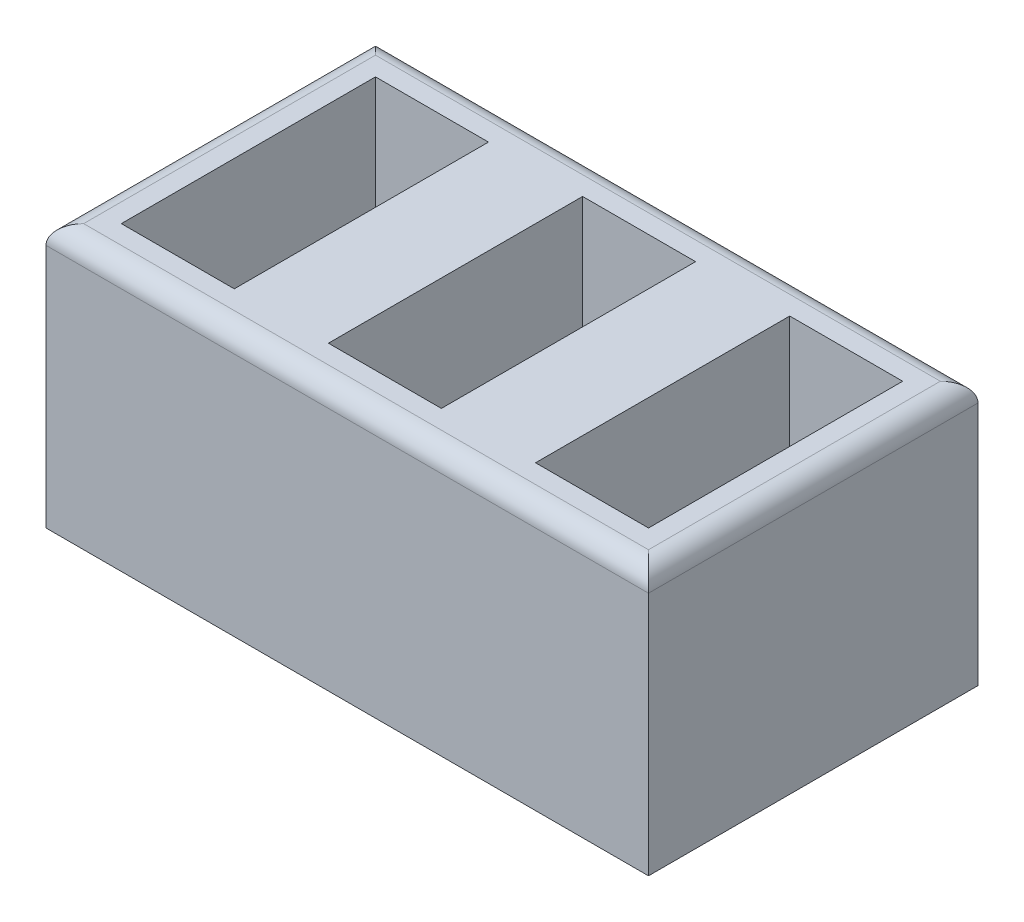
ISO-10303-21;
HEADER;
FILE_DESCRIPTION(('STEP AP214'),'2;1');
FILE_NAME('part.step','',(''),(''),'','','');
FILE_SCHEMA(('AUTOMOTIVE_DESIGN { 1 0 10303 214 1 1 1 1 }'));
ENDSEC;
DATA;
#1=APPLICATION_CONTEXT('core data for automotive mechanical design processes');
#2=APPLICATION_PROTOCOL_DEFINITION('international standard','automotive_design',2000,#1);
#3=PRODUCT_CONTEXT('',#1,'mechanical');
#4=PRODUCT('Part','Part','',(#3));
#5=PRODUCT_RELATED_PRODUCT_CATEGORY('part','',(#4));
#6=PRODUCT_DEFINITION_FORMATION('','',#4);
#7=PRODUCT_DEFINITION_CONTEXT('part definition',#1,'design');
#8=PRODUCT_DEFINITION('design','',#6,#7);
#9=PRODUCT_DEFINITION_SHAPE('','',#8);
#10=(LENGTH_UNIT() NAMED_UNIT(*) SI_UNIT(.MILLI.,.METRE.));
#11=(NAMED_UNIT(*) PLANE_ANGLE_UNIT() SI_UNIT($,.RADIAN.));
#12=(NAMED_UNIT(*) SI_UNIT($,.STERADIAN.) SOLID_ANGLE_UNIT());
#13=UNCERTAINTY_MEASURE_WITH_UNIT(LENGTH_MEASURE(1.E-05),#10,'distance_accuracy_value','');
#14=(GEOMETRIC_REPRESENTATION_CONTEXT(3) GLOBAL_UNCERTAINTY_ASSIGNED_CONTEXT((#13)) GLOBAL_UNIT_ASSIGNED_CONTEXT((#10,
#11,#12)) REPRESENTATION_CONTEXT('',''));
#15=CARTESIAN_POINT('',(0.,0.,0.));
#16=DIRECTION('',(0.,0.,1.));
#17=DIRECTION('',(1.,0.,0.));
#18=AXIS2_PLACEMENT_3D('',#15,#16,#17);
#19=CARTESIAN_POINT('',(22.,0.400000000000001,0.));
#20=DIRECTION('',(0.,1.,0.));
#21=DIRECTION('',(0.,0.,1.));
#22=AXIS2_PLACEMENT_3D('',#19,#20,#21);
#23=PLANE('',#22);
#24=DIRECTION('',(0.,0.,1.));
#25=VECTOR('',#24,1.);
#26=CARTESIAN_POINT('',(24.,0.400000000000001,-15.5));
#27=LINE('',#26,#25);
#28=CARTESIAN_POINT('',(24.,0.400000000000001,-15.5));
#29=VERTEX_POINT('',#28);
#30=CARTESIAN_POINT('',(24.,0.400000000000001,-2.));
#31=VERTEX_POINT('',#30);
#32=EDGE_CURVE('E267',#29,#31,#27,.T.);
#33=ORIENTED_EDGE('',*,*,#32,.T.);
#34=DIRECTION('',(1.,0.,0.));
#35=VECTOR('',#34,1.);
#36=CARTESIAN_POINT('',(24.,0.400000000000001,-2.));
#37=LINE('',#36,#35);
#38=CARTESIAN_POINT('',(30.,0.400000000000001,-2.));
#39=VERTEX_POINT('',#38);
#40=EDGE_CURVE('E285',#31,#39,#37,.T.);
#41=ORIENTED_EDGE('',*,*,#40,.T.);
#42=DIRECTION('',(0.,0.,-1.));
#43=VECTOR('',#42,1.);
#44=CARTESIAN_POINT('',(30.,0.400000000000001,-15.5));
#45=LINE('',#44,#43);
#46=CARTESIAN_POINT('',(30.,0.400000000000001,-15.5));
#47=VERTEX_POINT('',#46);
#48=EDGE_CURVE('E279',#39,#47,#45,.T.);
#49=ORIENTED_EDGE('',*,*,#48,.T.);
#50=DIRECTION('',(-1.,0.,0.));
#51=VECTOR('',#50,1.);
#52=CARTESIAN_POINT('',(24.,0.400000000000001,-15.5));
#53=LINE('',#52,#51);
#54=EDGE_CURVE('E273',#47,#29,#53,.T.);
#55=ORIENTED_EDGE('',*,*,#54,.T.);
#56=EDGE_LOOP('',(#33,#41,#49,#55));
#57=FACE_BOUND('',#56,.T.);
#58=ADVANCED_FACE('F36',(#57),#23,.T.);
#59=CARTESIAN_POINT('',(24.,0.400000000000001,-2.));
#60=DIRECTION('',(0.,0.,1.));
#61=DIRECTION('',(1.,0.,0.));
#62=AXIS2_PLACEMENT_3D('',#59,#60,#61);
#63=PLANE('',#62);
#64=DIRECTION('',(1.,0.,0.));
#65=VECTOR('',#64,1.);
#66=CARTESIAN_POINT('',(24.,14.,-2.));
#67=LINE('',#66,#65);
#68=CARTESIAN_POINT('',(24.,14.,-2.));
#69=VERTEX_POINT('',#68);
#70=CARTESIAN_POINT('',(30.,14.,-2.));
#71=VERTEX_POINT('',#70);
#72=EDGE_CURVE('E261',#69,#71,#67,.T.);
#73=ORIENTED_EDGE('',*,*,#72,.T.);
#74=DIRECTION('',(0.,1.,0.));
#75=VECTOR('',#74,1.);
#76=CARTESIAN_POINT('',(30.,0.400000000000001,-2.));
#77=LINE('',#76,#75);
#78=EDGE_CURVE('E282',#39,#71,#77,.T.);
#79=ORIENTED_EDGE('',*,*,#78,.F.);
#80=ORIENTED_EDGE('',*,*,#40,.F.);
#81=DIRECTION('',(0.,1.,0.));
#82=VECTOR('',#81,1.);
#83=CARTESIAN_POINT('',(24.,0.400000000000001,-2.));
#84=LINE('',#83,#82);
#85=EDGE_CURVE('E264',#31,#69,#84,.T.);
#86=ORIENTED_EDGE('',*,*,#85,.T.);
#87=EDGE_LOOP('',(#73,#79,#80,#86));
#88=FACE_BOUND('',#87,.T.);
#89=ADVANCED_FACE('F347',(#88),#63,.F.);
#90=CARTESIAN_POINT('',(30.,0.400000000000001,-15.5));
#91=DIRECTION('',(1.,0.,0.));
#92=DIRECTION('',(0.,0.,-1.));
#93=AXIS2_PLACEMENT_3D('',#90,#91,#92);
#94=PLANE('',#93);
#95=DIRECTION('',(0.,0.,-1.));
#96=VECTOR('',#95,1.);
#97=CARTESIAN_POINT('',(30.,14.,-15.5));
#98=LINE('',#97,#96);
#99=CARTESIAN_POINT('',(30.,14.,-15.5));
#100=VERTEX_POINT('',#99);
#101=EDGE_CURVE('E258',#71,#100,#98,.T.);
#102=ORIENTED_EDGE('',*,*,#101,.T.);
#103=DIRECTION('',(0.,1.,0.));
#104=VECTOR('',#103,1.);
#105=CARTESIAN_POINT('',(30.,0.400000000000001,-15.5));
#106=LINE('',#105,#104);
#107=EDGE_CURVE('E276',#47,#100,#106,.T.);
#108=ORIENTED_EDGE('',*,*,#107,.F.);
#109=ORIENTED_EDGE('',*,*,#48,.F.);
#110=ORIENTED_EDGE('',*,*,#78,.T.);
#111=EDGE_LOOP('',(#102,#108,#109,#110));
#112=FACE_BOUND('',#111,.T.);
#113=ADVANCED_FACE('F349',(#112),#94,.F.);
#114=CARTESIAN_POINT('',(24.,0.400000000000001,-15.5));
#115=DIRECTION('',(0.,0.,-1.));
#116=DIRECTION('',(-1.,0.,0.));
#117=AXIS2_PLACEMENT_3D('',#114,#115,#116);
#118=PLANE('',#117);
#119=DIRECTION('',(-1.,0.,0.));
#120=VECTOR('',#119,1.);
#121=CARTESIAN_POINT('',(24.,14.,-15.5));
#122=LINE('',#121,#120);
#123=CARTESIAN_POINT('',(24.,14.,-15.5));
#124=VERTEX_POINT('',#123);
#125=EDGE_CURVE('E255',#100,#124,#122,.T.);
#126=ORIENTED_EDGE('',*,*,#125,.T.);
#127=DIRECTION('',(0.,1.,0.));
#128=VECTOR('',#127,1.);
#129=CARTESIAN_POINT('',(24.,0.400000000000001,-15.5));
#130=LINE('',#129,#128);
#131=EDGE_CURVE('E270',#29,#124,#130,.T.);
#132=ORIENTED_EDGE('',*,*,#131,.F.);
#133=ORIENTED_EDGE('',*,*,#54,.F.);
#134=ORIENTED_EDGE('',*,*,#107,.T.);
#135=EDGE_LOOP('',(#126,#132,#133,#134));
#136=FACE_BOUND('',#135,.T.);
#137=ADVANCED_FACE('F340',(#136),#118,.F.);
#138=CARTESIAN_POINT('',(24.,0.400000000000001,-15.5));
#139=DIRECTION('',(-1.,0.,0.));
#140=DIRECTION('',(0.,0.,1.));
#141=AXIS2_PLACEMENT_3D('',#138,#139,#140);
#142=PLANE('',#141);
#143=DIRECTION('',(0.,0.,1.));
#144=VECTOR('',#143,1.);
#145=CARTESIAN_POINT('',(24.,14.,-15.5));
#146=LINE('',#145,#144);
#147=EDGE_CURVE('E253',#124,#69,#146,.T.);
#148=ORIENTED_EDGE('',*,*,#147,.T.);
#149=ORIENTED_EDGE('',*,*,#85,.F.);
#150=ORIENTED_EDGE('',*,*,#32,.F.);
#151=ORIENTED_EDGE('',*,*,#131,.T.);
#152=EDGE_LOOP('',(#148,#149,#150,#151));
#153=FACE_BOUND('',#152,.T.);
#154=ADVANCED_FACE('F342',(#153),#142,.F.);
#155=CARTESIAN_POINT('',(0.,14.,0.));
#156=DIRECTION('',(1.,0.,0.));
#157=DIRECTION('',(0.,0.,-1.));
#158=AXIS2_PLACEMENT_3D('',#155,#156,#157);
#159=PLANE('',#158);
#160=DIRECTION('',(0.,-1.,0.));
#161=VECTOR('',#160,1.);
#162=CARTESIAN_POINT('',(0.,14.,0.));
#163=LINE('',#162,#161);
#164=CARTESIAN_POINT('',(0.,13.,0.));
#165=VERTEX_POINT('',#164);
#166=CARTESIAN_POINT('',(0.,0.,0.));
#167=VERTEX_POINT('',#166);
#168=EDGE_CURVE('E251',#165,#167,#163,.T.);
#169=ORIENTED_EDGE('',*,*,#168,.F.);
#170=DIRECTION('',(0.,0.,1.));
#171=VECTOR('',#170,1.);
#172=CARTESIAN_POINT('',(0.,13.,0.));
#173=LINE('',#172,#171);
#174=CARTESIAN_POINT('',(0.,13.,-17.5));
#175=VERTEX_POINT('',#174);
#176=EDGE_CURVE('E297',#165,#175,#173,.F.);
#177=ORIENTED_EDGE('',*,*,#176,.T.);
#178=DIRECTION('',(0.,-1.,0.));
#179=VECTOR('',#178,1.);
#180=CARTESIAN_POINT('',(0.,14.,-17.5));
#181=LINE('',#180,#179);
#182=CARTESIAN_POINT('',(0.,0.,-17.5));
#183=VERTEX_POINT('',#182);
#184=EDGE_CURVE('E245',#175,#183,#181,.T.);
#185=ORIENTED_EDGE('',*,*,#184,.T.);
#186=DIRECTION('',(0.,0.,1.));
#187=VECTOR('',#186,1.);
#188=CARTESIAN_POINT('',(0.,0.,0.));
#189=LINE('',#188,#187);
#190=EDGE_CURVE('E227',#183,#167,#189,.T.);
#191=ORIENTED_EDGE('',*,*,#190,.T.);
#192=EDGE_LOOP('',(#169,#177,#185,#191));
#193=FACE_BOUND('',#192,.T.);
#194=ADVANCED_FACE('F387',(#193),#159,.F.);
#195=CARTESIAN_POINT('',(0.,14.,0.));
#196=DIRECTION('',(0.,0.,-1.));
#197=DIRECTION('',(-1.,0.,0.));
#198=AXIS2_PLACEMENT_3D('',#195,#196,#197);
#199=PLANE('',#198);
#200=DIRECTION('',(0.,-1.,0.));
#201=VECTOR('',#200,1.);
#202=CARTESIAN_POINT('',(32.,14.,0.));
#203=LINE('',#202,#201);
#204=CARTESIAN_POINT('',(32.,13.,0.));
#205=VERTEX_POINT('',#204);
#206=CARTESIAN_POINT('',(32.,0.,0.));
#207=VERTEX_POINT('',#206);
#208=EDGE_CURVE('E249',#205,#207,#203,.T.);
#209=ORIENTED_EDGE('',*,*,#208,.F.);
#210=DIRECTION('',(1.,0.,0.));
#211=VECTOR('',#210,1.);
#212=CARTESIAN_POINT('',(0.,13.,0.));
#213=LINE('',#212,#211);
#214=EDGE_CURVE('E45',#205,#165,#213,.F.);
#215=ORIENTED_EDGE('',*,*,#214,.T.);
#216=ORIENTED_EDGE('',*,*,#168,.T.);
#217=DIRECTION('',(1.,0.,0.));
#218=VECTOR('',#217,1.);
#219=CARTESIAN_POINT('',(0.,0.,0.));
#220=LINE('',#219,#218);
#221=EDGE_CURVE('E236',#167,#207,#220,.T.);
#222=ORIENTED_EDGE('',*,*,#221,.T.);
#223=EDGE_LOOP('',(#209,#215,#216,#222));
#224=FACE_BOUND('',#223,.T.);
#225=ADVANCED_FACE('F383',(#224),#199,.F.);
#226=CARTESIAN_POINT('',(32.,14.,0.));
#227=DIRECTION('',(-1.,0.,0.));
#228=DIRECTION('',(0.,0.,1.));
#229=AXIS2_PLACEMENT_3D('',#226,#227,#228);
#230=PLANE('',#229);
#231=DIRECTION('',(0.,-1.,0.));
#232=VECTOR('',#231,1.);
#233=CARTESIAN_POINT('',(32.,14.,-17.5));
#234=LINE('',#233,#232);
#235=CARTESIAN_POINT('',(32.,13.,-17.5));
#236=VERTEX_POINT('',#235);
#237=CARTESIAN_POINT('',(32.,0.,-17.5));
#238=VERTEX_POINT('',#237);
#239=EDGE_CURVE('E247',#236,#238,#234,.T.);
#240=ORIENTED_EDGE('',*,*,#239,.F.);
#241=DIRECTION('',(0.,0.,-1.));
#242=VECTOR('',#241,1.);
#243=CARTESIAN_POINT('',(32.,13.,0.));
#244=LINE('',#243,#242);
#245=EDGE_CURVE('E11',#236,#205,#244,.F.);
#246=ORIENTED_EDGE('',*,*,#245,.T.);
#247=ORIENTED_EDGE('',*,*,#208,.T.);
#248=DIRECTION('',(0.,0.,-1.));
#249=VECTOR('',#248,1.);
#250=CARTESIAN_POINT('',(32.,0.,0.));
#251=LINE('',#250,#249);
#252=EDGE_CURVE('E239',#207,#238,#251,.T.);
#253=ORIENTED_EDGE('',*,*,#252,.T.);
#254=EDGE_LOOP('',(#240,#246,#247,#253));
#255=FACE_BOUND('',#254,.T.);
#256=ADVANCED_FACE('F394',(#255),#230,.F.);
#257=CARTESIAN_POINT('',(0.,14.,-17.5));
#258=DIRECTION('',(0.,0.,1.));
#259=DIRECTION('',(1.,0.,0.));
#260=AXIS2_PLACEMENT_3D('',#257,#258,#259);
#261=PLANE('',#260);
#262=ORIENTED_EDGE('',*,*,#184,.F.);
#263=DIRECTION('',(-1.,0.,0.));
#264=VECTOR('',#263,1.);
#265=CARTESIAN_POINT('',(0.,13.,-17.5));
#266=LINE('',#265,#264);
#267=EDGE_CURVE('E59',#175,#236,#266,.F.);
#268=ORIENTED_EDGE('',*,*,#267,.T.);
#269=ORIENTED_EDGE('',*,*,#239,.T.);
#270=DIRECTION('',(-1.,0.,0.));
#271=VECTOR('',#270,1.);
#272=CARTESIAN_POINT('',(0.,0.,-17.5));
#273=LINE('',#272,#271);
#274=EDGE_CURVE('E242',#238,#183,#273,.T.);
#275=ORIENTED_EDGE('',*,*,#274,.T.);
#276=EDGE_LOOP('',(#262,#268,#269,#275));
#277=FACE_BOUND('',#276,.T.);
#278=ADVANCED_FACE('F329',(#277),#261,.F.);
#279=CARTESIAN_POINT('',(0.,14.,0.));
#280=DIRECTION('',(0.,-1.,0.));
#281=DIRECTION('',(0.,0.,-1.));
#282=AXIS2_PLACEMENT_3D('',#279,#280,#281);
#283=PLANE('',#282);
#284=DIRECTION('',(-1.,0.,0.));
#285=VECTOR('',#284,1.);
#286=CARTESIAN_POINT('',(0.,14.,-16.5));
#287=LINE('',#286,#285);
#288=CARTESIAN_POINT('',(31.,14.,-16.5));
#289=VERTEX_POINT('',#288);
#290=CARTESIAN_POINT('',(1.,14.,-16.5));
#291=VERTEX_POINT('',#290);
#292=EDGE_CURVE('E292',#289,#291,#287,.T.);
#293=ORIENTED_EDGE('',*,*,#292,.T.);
#294=DIRECTION('',(0.,0.,1.));
#295=VECTOR('',#294,1.);
#296=CARTESIAN_POINT('',(1.,14.,0.));
#297=LINE('',#296,#295);
#298=CARTESIAN_POINT('',(1.,14.,-1.));
#299=VERTEX_POINT('',#298);
#300=EDGE_CURVE('E294',#291,#299,#297,.T.);
#301=ORIENTED_EDGE('',*,*,#300,.T.);
#302=DIRECTION('',(1.,0.,0.));
#303=VECTOR('',#302,1.);
#304=CARTESIAN_POINT('',(0.,14.,-1.));
#305=LINE('',#304,#303);
#306=CARTESIAN_POINT('',(31.,14.,-1.));
#307=VERTEX_POINT('',#306);
#308=EDGE_CURVE('E290',#299,#307,#305,.T.);
#309=ORIENTED_EDGE('',*,*,#308,.T.);
#310=DIRECTION('',(0.,0.,-1.));
#311=VECTOR('',#310,1.);
#312=CARTESIAN_POINT('',(31.,14.,0.));
#313=LINE('',#312,#311);
#314=EDGE_CURVE('E288',#307,#289,#313,.T.);
#315=ORIENTED_EDGE('',*,*,#314,.T.);
#316=EDGE_LOOP('',(#293,#301,#309,#315));
#317=FACE_BOUND('',#316,.T.);
#318=DIRECTION('',(1.,0.,0.));
#319=VECTOR('',#318,1.);
#320=CARTESIAN_POINT('',(13.,14.,-2.));
#321=LINE('',#320,#319);
#322=CARTESIAN_POINT('',(13.,14.,-2.));
#323=VERTEX_POINT('',#322);
#324=CARTESIAN_POINT('',(19.,14.,-2.));
#325=VERTEX_POINT('',#324);
#326=EDGE_CURVE('E172',#323,#325,#321,.T.);
#327=ORIENTED_EDGE('',*,*,#326,.F.);
#328=DIRECTION('',(0.,0.,1.));
#329=VECTOR('',#328,1.);
#330=CARTESIAN_POINT('',(13.,14.,-15.5));
#331=LINE('',#330,#329);
#332=CARTESIAN_POINT('',(13.,14.,-15.5));
#333=VERTEX_POINT('',#332);
#334=EDGE_CURVE('E186',#333,#323,#331,.T.);
#335=ORIENTED_EDGE('',*,*,#334,.F.);
#336=DIRECTION('',(-1.,0.,0.));
#337=VECTOR('',#336,1.);
#338=CARTESIAN_POINT('',(13.,14.,-15.5));
#339=LINE('',#338,#337);
#340=CARTESIAN_POINT('',(19.,14.,-15.5));
#341=VERTEX_POINT('',#340);
#342=EDGE_CURVE('E196',#341,#333,#339,.T.);
#343=ORIENTED_EDGE('',*,*,#342,.F.);
#344=DIRECTION('',(0.,0.,-1.));
#345=VECTOR('',#344,1.);
#346=CARTESIAN_POINT('',(19.,14.,-15.5));
#347=LINE('',#346,#345);
#348=EDGE_CURVE('E187',#325,#341,#347,.T.);
#349=ORIENTED_EDGE('',*,*,#348,.F.);
#350=EDGE_LOOP('',(#327,#335,#343,#349));
#351=FACE_BOUND('',#350,.T.);
#352=DIRECTION('',(1.,0.,0.));
#353=VECTOR('',#352,1.);
#354=CARTESIAN_POINT('',(2.,14.,-2.));
#355=LINE('',#354,#353);
#356=CARTESIAN_POINT('',(2.,14.,-2.));
#357=VERTEX_POINT('',#356);
#358=CARTESIAN_POINT('',(8.,14.,-2.));
#359=VERTEX_POINT('',#358);
#360=EDGE_CURVE('E217',#357,#359,#355,.T.);
#361=ORIENTED_EDGE('',*,*,#360,.F.);
#362=DIRECTION('',(0.,0.,1.));
#363=VECTOR('',#362,1.);
#364=CARTESIAN_POINT('',(2.,14.,-15.5));
#365=LINE('',#364,#363);
#366=CARTESIAN_POINT('',(2.,14.,-15.5));
#367=VERTEX_POINT('',#366);
#368=EDGE_CURVE('E201',#367,#357,#365,.T.);
#369=ORIENTED_EDGE('',*,*,#368,.F.);
#370=DIRECTION('',(-1.,0.,0.));
#371=VECTOR('',#370,1.);
#372=CARTESIAN_POINT('',(2.,14.,-15.5));
#373=LINE('',#372,#371);
#374=CARTESIAN_POINT('',(8.,14.,-15.5));
#375=VERTEX_POINT('',#374);
#376=EDGE_CURVE('E206',#375,#367,#373,.T.);
#377=ORIENTED_EDGE('',*,*,#376,.F.);
#378=DIRECTION('',(0.,0.,-1.));
#379=VECTOR('',#378,1.);
#380=CARTESIAN_POINT('',(8.,14.,-15.5));
#381=LINE('',#380,#379);
#382=EDGE_CURVE('E220',#359,#375,#381,.T.);
#383=ORIENTED_EDGE('',*,*,#382,.F.);
#384=EDGE_LOOP('',(#361,#369,#377,#383));
#385=FACE_BOUND('',#384,.T.);
#386=ORIENTED_EDGE('',*,*,#147,.F.);
#387=ORIENTED_EDGE('',*,*,#125,.F.);
#388=ORIENTED_EDGE('',*,*,#101,.F.);
#389=ORIENTED_EDGE('',*,*,#72,.F.);
#390=EDGE_LOOP('',(#386,#387,#388,#389));
#391=FACE_BOUND('',#390,.T.);
#392=ADVANCED_FACE('F325',(#317,#351,#385,#391),#283,.F.);
#393=CARTESIAN_POINT('',(0.,0.,0.));
#394=DIRECTION('',(0.,-1.,0.));
#395=DIRECTION('',(0.,0.,-1.));
#396=AXIS2_PLACEMENT_3D('',#393,#394,#395);
#397=PLANE('',#396);
#398=ORIENTED_EDGE('',*,*,#190,.F.);
#399=ORIENTED_EDGE('',*,*,#274,.F.);
#400=ORIENTED_EDGE('',*,*,#252,.F.);
#401=ORIENTED_EDGE('',*,*,#221,.F.);
#402=EDGE_LOOP('',(#398,#399,#400,#401));
#403=FACE_BOUND('',#402,.T.);
#404=ADVANCED_FACE('F328',(#403),#397,.T.);
#405=CARTESIAN_POINT('',(2.,0.400000000000001,-15.5));
#406=DIRECTION('',(-1.,0.,0.));
#407=DIRECTION('',(0.,0.,1.));
#408=AXIS2_PLACEMENT_3D('',#405,#406,#407);
#409=PLANE('',#408);
#410=ORIENTED_EDGE('',*,*,#368,.T.);
#411=DIRECTION('',(0.,1.,0.));
#412=VECTOR('',#411,1.);
#413=CARTESIAN_POINT('',(2.,0.400000000000001,-2.));
#414=LINE('',#413,#412);
#415=CARTESIAN_POINT('',(2.,0.400000000000001,-2.));
#416=VERTEX_POINT('',#415);
#417=EDGE_CURVE('E215',#416,#357,#414,.T.);
#418=ORIENTED_EDGE('',*,*,#417,.F.);
#419=DIRECTION('',(0.,0.,1.));
#420=VECTOR('',#419,1.);
#421=CARTESIAN_POINT('',(2.,0.400000000000001,-15.5));
#422=LINE('',#421,#420);
#423=CARTESIAN_POINT('',(2.,0.400000000000001,-15.5));
#424=VERTEX_POINT('',#423);
#425=EDGE_CURVE('E202',#424,#416,#422,.T.);
#426=ORIENTED_EDGE('',*,*,#425,.F.);
#427=DIRECTION('',(0.,1.,0.));
#428=VECTOR('',#427,1.);
#429=CARTESIAN_POINT('',(2.,0.400000000000001,-15.5));
#430=LINE('',#429,#428);
#431=EDGE_CURVE('E225',#424,#367,#430,.T.);
#432=ORIENTED_EDGE('',*,*,#431,.T.);
#433=EDGE_LOOP('',(#410,#418,#426,#432));
#434=FACE_BOUND('',#433,.T.);
#435=ADVANCED_FACE('F546',(#434),#409,.F.);
#436=CARTESIAN_POINT('',(2.,0.400000000000001,-15.5));
#437=DIRECTION('',(0.,0.,-1.));
#438=DIRECTION('',(-1.,0.,0.));
#439=AXIS2_PLACEMENT_3D('',#436,#437,#438);
#440=PLANE('',#439);
#441=ORIENTED_EDGE('',*,*,#376,.T.);
#442=ORIENTED_EDGE('',*,*,#431,.F.);
#443=DIRECTION('',(-1.,0.,0.));
#444=VECTOR('',#443,1.);
#445=CARTESIAN_POINT('',(2.,0.400000000000001,-15.5));
#446=LINE('',#445,#444);
#447=CARTESIAN_POINT('',(8.,0.400000000000001,-15.5));
#448=VERTEX_POINT('',#447);
#449=EDGE_CURVE('E212',#448,#424,#446,.T.);
#450=ORIENTED_EDGE('',*,*,#449,.F.);
#451=DIRECTION('',(0.,1.,0.));
#452=VECTOR('',#451,1.);
#453=CARTESIAN_POINT('',(8.,0.400000000000001,-15.5));
#454=LINE('',#453,#452);
#455=EDGE_CURVE('E228',#448,#375,#454,.T.);
#456=ORIENTED_EDGE('',*,*,#455,.T.);
#457=EDGE_LOOP('',(#441,#442,#450,#456));
#458=FACE_BOUND('',#457,.T.);
#459=ADVANCED_FACE('F537',(#458),#440,.F.);
#460=CARTESIAN_POINT('',(8.,0.400000000000001,-15.5));
#461=DIRECTION('',(1.,0.,0.));
#462=DIRECTION('',(0.,0.,-1.));
#463=AXIS2_PLACEMENT_3D('',#460,#461,#462);
#464=PLANE('',#463);
#465=ORIENTED_EDGE('',*,*,#382,.T.);
#466=ORIENTED_EDGE('',*,*,#455,.F.);
#467=DIRECTION('',(0.,0.,-1.));
#468=VECTOR('',#467,1.);
#469=CARTESIAN_POINT('',(8.,0.400000000000001,-15.5));
#470=LINE('',#469,#468);
#471=CARTESIAN_POINT('',(8.,0.400000000000001,-2.));
#472=VERTEX_POINT('',#471);
#473=EDGE_CURVE('E209',#472,#448,#470,.T.);
#474=ORIENTED_EDGE('',*,*,#473,.F.);
#475=DIRECTION('',(0.,1.,0.));
#476=VECTOR('',#475,1.);
#477=CARTESIAN_POINT('',(8.,0.400000000000001,-2.));
#478=LINE('',#477,#476);
#479=EDGE_CURVE('E230',#472,#359,#478,.T.);
#480=ORIENTED_EDGE('',*,*,#479,.T.);
#481=EDGE_LOOP('',(#465,#466,#474,#480));
#482=FACE_BOUND('',#481,.T.);
#483=ADVANCED_FACE('F528',(#482),#464,.F.);
#484=CARTESIAN_POINT('',(2.,0.400000000000001,-2.));
#485=DIRECTION('',(0.,0.,1.));
#486=DIRECTION('',(1.,0.,0.));
#487=AXIS2_PLACEMENT_3D('',#484,#485,#486);
#488=PLANE('',#487);
#489=ORIENTED_EDGE('',*,*,#360,.T.);
#490=ORIENTED_EDGE('',*,*,#479,.F.);
#491=DIRECTION('',(1.,0.,0.));
#492=VECTOR('',#491,1.);
#493=CARTESIAN_POINT('',(2.,0.400000000000001,-2.));
#494=LINE('',#493,#492);
#495=EDGE_CURVE('E205',#416,#472,#494,.T.);
#496=ORIENTED_EDGE('',*,*,#495,.F.);
#497=ORIENTED_EDGE('',*,*,#417,.T.);
#498=EDGE_LOOP('',(#489,#490,#496,#497));
#499=FACE_BOUND('',#498,.T.);
#500=ADVANCED_FACE('F519',(#499),#488,.F.);
#501=CARTESIAN_POINT('',(0.,0.400000000000001,0.));
#502=DIRECTION('',(0.,1.,0.));
#503=DIRECTION('',(0.,0.,1.));
#504=AXIS2_PLACEMENT_3D('',#501,#502,#503);
#505=PLANE('',#504);
#506=ORIENTED_EDGE('',*,*,#425,.T.);
#507=ORIENTED_EDGE('',*,*,#495,.T.);
#508=ORIENTED_EDGE('',*,*,#473,.T.);
#509=ORIENTED_EDGE('',*,*,#449,.T.);
#510=EDGE_LOOP('',(#506,#507,#508,#509));
#511=FACE_BOUND('',#510,.T.);
#512=ADVANCED_FACE('F491',(#511),#505,.T.);
#513=CARTESIAN_POINT('',(13.,0.400000000000001,-15.5));
#514=DIRECTION('',(-1.,0.,0.));
#515=DIRECTION('',(0.,0.,1.));
#516=AXIS2_PLACEMENT_3D('',#513,#514,#515);
#517=PLANE('',#516);
#518=ORIENTED_EDGE('',*,*,#334,.T.);
#519=DIRECTION('',(0.,1.,0.));
#520=VECTOR('',#519,1.);
#521=CARTESIAN_POINT('',(13.,0.400000000000001,-2.));
#522=LINE('',#521,#520);
#523=CARTESIAN_POINT('',(13.,0.400000000000001,-2.));
#524=VERTEX_POINT('',#523);
#525=EDGE_CURVE('E178',#524,#323,#522,.T.);
#526=ORIENTED_EDGE('',*,*,#525,.F.);
#527=DIRECTION('',(0.,0.,1.));
#528=VECTOR('',#527,1.);
#529=CARTESIAN_POINT('',(13.,0.400000000000001,-15.5));
#530=LINE('',#529,#528);
#531=CARTESIAN_POINT('',(13.,0.400000000000001,-15.5));
#532=VERTEX_POINT('',#531);
#533=EDGE_CURVE('E161',#532,#524,#530,.T.);
#534=ORIENTED_EDGE('',*,*,#533,.F.);
#535=DIRECTION('',(0.,1.,0.));
#536=VECTOR('',#535,1.);
#537=CARTESIAN_POINT('',(13.,0.400000000000001,-15.5));
#538=LINE('',#537,#536);
#539=EDGE_CURVE('E198',#532,#333,#538,.T.);
#540=ORIENTED_EDGE('',*,*,#539,.T.);
#541=EDGE_LOOP('',(#518,#526,#534,#540));
#542=FACE_BOUND('',#541,.T.);
#543=ADVANCED_FACE('F184',(#542),#517,.F.);
#544=CARTESIAN_POINT('',(13.,0.400000000000001,-15.5));
#545=DIRECTION('',(0.,0.,-1.));
#546=DIRECTION('',(-1.,0.,0.));
#547=AXIS2_PLACEMENT_3D('',#544,#545,#546);
#548=PLANE('',#547);
#549=ORIENTED_EDGE('',*,*,#342,.T.);
#550=ORIENTED_EDGE('',*,*,#539,.F.);
#551=DIRECTION('',(-1.,0.,0.));
#552=VECTOR('',#551,1.);
#553=CARTESIAN_POINT('',(13.,0.400000000000001,-15.5));
#554=LINE('',#553,#552);
#555=CARTESIAN_POINT('',(19.,0.400000000000001,-15.5));
#556=VERTEX_POINT('',#555);
#557=EDGE_CURVE('E167',#556,#532,#554,.T.);
#558=ORIENTED_EDGE('',*,*,#557,.F.);
#559=DIRECTION('',(0.,1.,0.));
#560=VECTOR('',#559,1.);
#561=CARTESIAN_POINT('',(19.,0.400000000000001,-15.5));
#562=LINE('',#561,#560);
#563=EDGE_CURVE('E189',#556,#341,#562,.T.);
#564=ORIENTED_EDGE('',*,*,#563,.T.);
#565=EDGE_LOOP('',(#549,#550,#558,#564));
#566=FACE_BOUND('',#565,.T.);
#567=ADVANCED_FACE('F320',(#566),#548,.F.);
#568=CARTESIAN_POINT('',(19.,0.400000000000001,-15.5));
#569=DIRECTION('',(1.,0.,0.));
#570=DIRECTION('',(0.,0.,-1.));
#571=AXIS2_PLACEMENT_3D('',#568,#569,#570);
#572=PLANE('',#571);
#573=ORIENTED_EDGE('',*,*,#348,.T.);
#574=ORIENTED_EDGE('',*,*,#563,.F.);
#575=DIRECTION('',(0.,0.,-1.));
#576=VECTOR('',#575,1.);
#577=CARTESIAN_POINT('',(19.,0.400000000000001,-15.5));
#578=LINE('',#577,#576);
#579=CARTESIAN_POINT('',(19.,0.400000000000001,-2.));
#580=VERTEX_POINT('',#579);
#581=EDGE_CURVE('E182',#580,#556,#578,.T.);
#582=ORIENTED_EDGE('',*,*,#581,.F.);
#583=DIRECTION('',(0.,1.,0.));
#584=VECTOR('',#583,1.);
#585=CARTESIAN_POINT('',(19.,0.400000000000001,-2.));
#586=LINE('',#585,#584);
#587=EDGE_CURVE('E181',#580,#325,#586,.T.);
#588=ORIENTED_EDGE('',*,*,#587,.T.);
#589=EDGE_LOOP('',(#573,#574,#582,#588));
#590=FACE_BOUND('',#589,.T.);
#591=ADVANCED_FACE('F322',(#590),#572,.F.);
#592=CARTESIAN_POINT('',(13.,0.400000000000001,-2.));
#593=DIRECTION('',(0.,0.,1.));
#594=DIRECTION('',(1.,0.,0.));
#595=AXIS2_PLACEMENT_3D('',#592,#593,#594);
#596=PLANE('',#595);
#597=ORIENTED_EDGE('',*,*,#326,.T.);
#598=ORIENTED_EDGE('',*,*,#587,.F.);
#599=DIRECTION('',(1.,0.,0.));
#600=VECTOR('',#599,1.);
#601=CARTESIAN_POINT('',(13.,0.400000000000001,-2.));
#602=LINE('',#601,#600);
#603=EDGE_CURVE('E164',#524,#580,#602,.T.);
#604=ORIENTED_EDGE('',*,*,#603,.F.);
#605=ORIENTED_EDGE('',*,*,#525,.T.);
#606=EDGE_LOOP('',(#597,#598,#604,#605));
#607=FACE_BOUND('',#606,.T.);
#608=ADVANCED_FACE('F177',(#607),#596,.F.);
#609=CARTESIAN_POINT('',(11.,0.400000000000001,0.));
#610=DIRECTION('',(0.,1.,0.));
#611=DIRECTION('',(0.,0.,1.));
#612=AXIS2_PLACEMENT_3D('',#609,#610,#611);
#613=PLANE('',#612);
#614=ORIENTED_EDGE('',*,*,#533,.T.);
#615=ORIENTED_EDGE('',*,*,#603,.T.);
#616=ORIENTED_EDGE('',*,*,#581,.T.);
#617=ORIENTED_EDGE('',*,*,#557,.T.);
#618=EDGE_LOOP('',(#614,#615,#616,#617));
#619=FACE_BOUND('',#618,.T.);
#620=ADVANCED_FACE('F163',(#619),#613,.T.);
#621=CARTESIAN_POINT('',(31.,13.,0.));
#622=DIRECTION('',(0.,0.,-1.));
#623=DIRECTION('',(-1.,0.,0.));
#624=AXIS2_PLACEMENT_3D('',#621,#622,#623);
#625=CYLINDRICAL_SURFACE('',#624,1.);
#626=CARTESIAN_POINT('',(31.,13.,-1.));
#627=DIRECTION('',(0.707106781186547,0.,-0.707106781186547));
#628=DIRECTION('',(-0.707106781186547,0.,-0.707106781186547));
#629=AXIS2_PLACEMENT_3D('',#626,#627,#628);
#630=ELLIPSE('',#629,1.41421356237309,1.);
#631=EDGE_CURVE('E305',#205,#307,#630,.F.);
#632=ORIENTED_EDGE('',*,*,#631,.F.);
#633=ORIENTED_EDGE('',*,*,#245,.F.);
#634=CARTESIAN_POINT('',(31.,13.,-16.5));
#635=DIRECTION('',(-0.707106781186547,0.,-0.707106781186547));
#636=DIRECTION('',(0.707106781186547,0.,-0.707106781186547));
#637=AXIS2_PLACEMENT_3D('',#634,#635,#636);
#638=ELLIPSE('',#637,1.41421356237309,1.);
#639=EDGE_CURVE('E40',#289,#236,#638,.T.);
#640=ORIENTED_EDGE('',*,*,#639,.F.);
#641=ORIENTED_EDGE('',*,*,#314,.F.);
#642=EDGE_LOOP('',(#632,#633,#640,#641));
#643=FACE_BOUND('',#642,.T.);
#644=ADVANCED_FACE('F38',(#643),#625,.T.);
#645=CARTESIAN_POINT('',(0.,13.,-16.5));
#646=DIRECTION('',(-1.,0.,0.));
#647=DIRECTION('',(0.,0.,1.));
#648=AXIS2_PLACEMENT_3D('',#645,#646,#647);
#649=CYLINDRICAL_SURFACE('',#648,1.);
#650=ORIENTED_EDGE('',*,*,#639,.T.);
#651=ORIENTED_EDGE('',*,*,#267,.F.);
#652=CARTESIAN_POINT('',(1.,13.,-16.5));
#653=DIRECTION('',(-0.707106781186547,0.,0.707106781186547));
#654=DIRECTION('',(-0.707106781186547,0.,-0.707106781186547));
#655=AXIS2_PLACEMENT_3D('',#652,#653,#654);
#656=ELLIPSE('',#655,1.41421356237309,1.);
#657=EDGE_CURVE('E304',#291,#175,#656,.T.);
#658=ORIENTED_EDGE('',*,*,#657,.F.);
#659=ORIENTED_EDGE('',*,*,#292,.F.);
#660=EDGE_LOOP('',(#650,#651,#658,#659));
#661=FACE_BOUND('',#660,.T.);
#662=ADVANCED_FACE('F369',(#661),#649,.T.);
#663=CARTESIAN_POINT('',(0.,13.,-1.));
#664=DIRECTION('',(1.,0.,0.));
#665=DIRECTION('',(0.,0.,-1.));
#666=AXIS2_PLACEMENT_3D('',#663,#664,#665);
#667=CYLINDRICAL_SURFACE('',#666,1.);
#668=ORIENTED_EDGE('',*,*,#631,.T.);
#669=ORIENTED_EDGE('',*,*,#308,.F.);
#670=CARTESIAN_POINT('',(1.,13.,-1.));
#671=DIRECTION('',(0.707106781186547,0.,0.707106781186547));
#672=DIRECTION('',(0.707106781186547,0.,-0.707106781186547));
#673=AXIS2_PLACEMENT_3D('',#670,#671,#672);
#674=ELLIPSE('',#673,1.41421356237309,1.);
#675=EDGE_CURVE('E302',#165,#299,#674,.F.);
#676=ORIENTED_EDGE('',*,*,#675,.F.);
#677=ORIENTED_EDGE('',*,*,#214,.F.);
#678=EDGE_LOOP('',(#668,#669,#676,#677));
#679=FACE_BOUND('',#678,.T.);
#680=ADVANCED_FACE('F366',(#679),#667,.T.);
#681=CARTESIAN_POINT('',(1.,13.,0.));
#682=DIRECTION('',(0.,0.,1.));
#683=DIRECTION('',(1.,0.,0.));
#684=AXIS2_PLACEMENT_3D('',#681,#682,#683);
#685=CYLINDRICAL_SURFACE('',#684,1.);
#686=ORIENTED_EDGE('',*,*,#657,.T.);
#687=ORIENTED_EDGE('',*,*,#176,.F.);
#688=ORIENTED_EDGE('',*,*,#675,.T.);
#689=ORIENTED_EDGE('',*,*,#300,.F.);
#690=EDGE_LOOP('',(#686,#687,#688,#689));
#691=FACE_BOUND('',#690,.T.);
#692=ADVANCED_FACE('F363',(#691),#685,.T.);
#693=CLOSED_SHELL('',(#58,#89,#113,#137,#154,#194,#225,#256,#278,#392,#404,#435,#459,#483,#500,
#512,#543,#567,#591,#608,#620,#644,#662,#680,#692));
#694=MANIFOLD_SOLID_BREP('B2',#693);
#695=ADVANCED_BREP_SHAPE_REPRESENTATION('',(#18,#694),#14);
#696=SHAPE_DEFINITION_REPRESENTATION(#9,#695);
ENDSEC;
END-ISO-10303-21;
